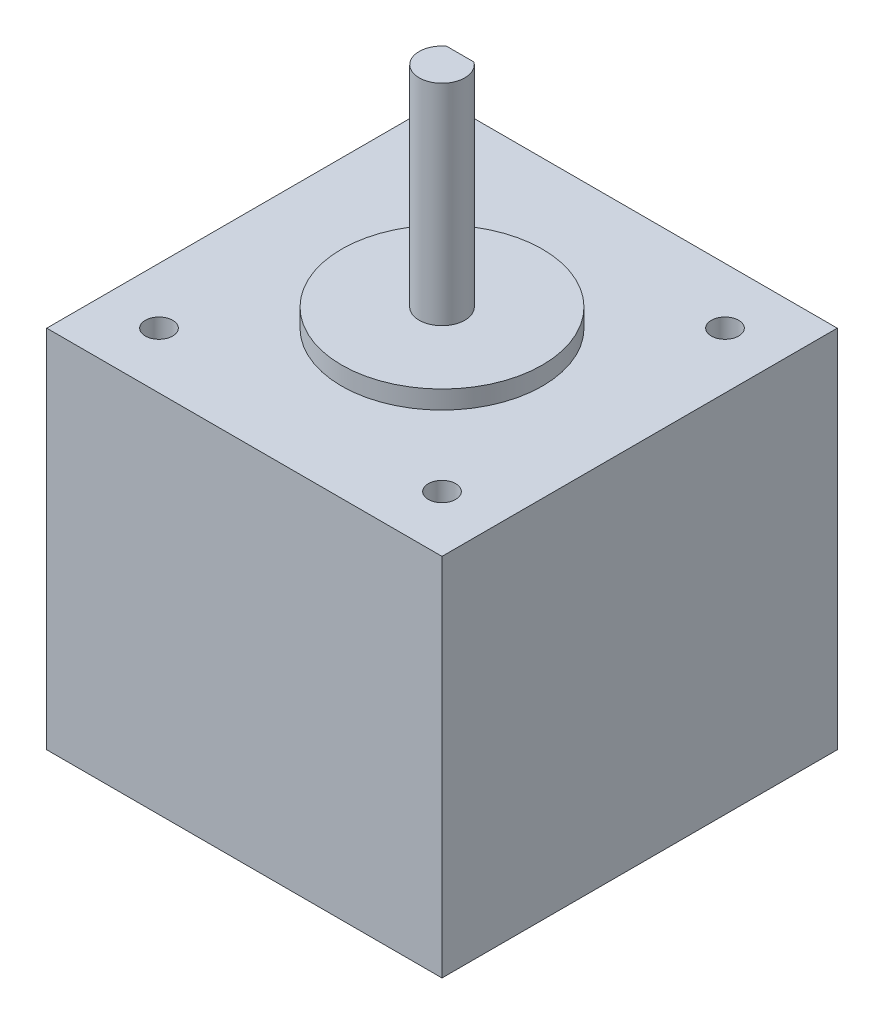
ISO-10303-21;
HEADER;
FILE_DESCRIPTION(('STEP AP214'),'2;1');
FILE_NAME('part.step','',(''),(''),'','','');
FILE_SCHEMA(('AUTOMOTIVE_DESIGN { 1 0 10303 214 1 1 1 1 }'));
ENDSEC;
DATA;
#1=APPLICATION_CONTEXT('core data for automotive mechanical design processes');
#2=APPLICATION_PROTOCOL_DEFINITION('international standard','automotive_design',2000,#1);
#3=PRODUCT_CONTEXT('',#1,'mechanical');
#4=PRODUCT('Part','Part','',(#3));
#5=PRODUCT_RELATED_PRODUCT_CATEGORY('part','',(#4));
#6=PRODUCT_DEFINITION_FORMATION('','',#4);
#7=PRODUCT_DEFINITION_CONTEXT('part definition',#1,'design');
#8=PRODUCT_DEFINITION('design','',#6,#7);
#9=PRODUCT_DEFINITION_SHAPE('','',#8);
#10=(LENGTH_UNIT() NAMED_UNIT(*) SI_UNIT(.MILLI.,.METRE.));
#11=(NAMED_UNIT(*) PLANE_ANGLE_UNIT() SI_UNIT($,.RADIAN.));
#12=(NAMED_UNIT(*) SI_UNIT($,.STERADIAN.) SOLID_ANGLE_UNIT());
#13=UNCERTAINTY_MEASURE_WITH_UNIT(LENGTH_MEASURE(1.E-05),#10,'distance_accuracy_value','');
#14=(GEOMETRIC_REPRESENTATION_CONTEXT(3) GLOBAL_UNCERTAINTY_ASSIGNED_CONTEXT((#13)) GLOBAL_UNIT_ASSIGNED_CONTEXT((#10,
#11,#12)) REPRESENTATION_CONTEXT('',''));
#15=CARTESIAN_POINT('',(0.,0.,0.));
#16=DIRECTION('',(0.,0.,1.));
#17=DIRECTION('',(1.,0.,0.));
#18=AXIS2_PLACEMENT_3D('',#15,#16,#17);
#19=CARTESIAN_POINT('',(21.65,40.,-21.65));
#20=DIRECTION('',(-1.,0.,0.));
#21=DIRECTION('',(0.,0.,1.));
#22=AXIS2_PLACEMENT_3D('',#19,#20,#21);
#23=PLANE('',#22);
#24=DIRECTION('',(0.,0.,-1.));
#25=VECTOR('',#24,1.);
#26=CARTESIAN_POINT('',(21.65,0.,-21.65));
#27=LINE('',#26,#25);
#28=CARTESIAN_POINT('',(21.65,0.,21.65));
#29=VERTEX_POINT('',#28);
#30=CARTESIAN_POINT('',(21.65,0.,-21.65));
#31=VERTEX_POINT('',#30);
#32=EDGE_CURVE('E131',#29,#31,#27,.T.);
#33=ORIENTED_EDGE('',*,*,#32,.T.);
#34=DIRECTION('',(0.,-1.,0.));
#35=VECTOR('',#34,1.);
#36=CARTESIAN_POINT('',(21.65,40.,-21.65));
#37=LINE('',#36,#35);
#38=CARTESIAN_POINT('',(21.65,40.,-21.65));
#39=VERTEX_POINT('',#38);
#40=EDGE_CURVE('E136',#39,#31,#37,.T.);
#41=ORIENTED_EDGE('',*,*,#40,.F.);
#42=DIRECTION('',(0.,0.,-1.));
#43=VECTOR('',#42,1.);
#44=CARTESIAN_POINT('',(21.65,40.,-21.65));
#45=LINE('',#44,#43);
#46=CARTESIAN_POINT('',(21.65,40.,21.65));
#47=VERTEX_POINT('',#46);
#48=EDGE_CURVE('E137',#47,#39,#45,.T.);
#49=ORIENTED_EDGE('',*,*,#48,.F.);
#50=DIRECTION('',(0.,-1.,0.));
#51=VECTOR('',#50,1.);
#52=CARTESIAN_POINT('',(21.65,40.,21.65));
#53=LINE('',#52,#51);
#54=EDGE_CURVE('E147',#47,#29,#53,.T.);
#55=ORIENTED_EDGE('',*,*,#54,.T.);
#56=EDGE_LOOP('',(#33,#41,#49,#55));
#57=FACE_BOUND('',#56,.T.);
#58=ADVANCED_FACE('F43',(#57),#23,.F.);
#59=CARTESIAN_POINT('',(-21.65,40.,-21.65));
#60=DIRECTION('',(0.,0.,1.));
#61=DIRECTION('',(1.,0.,0.));
#62=AXIS2_PLACEMENT_3D('',#59,#60,#61);
#63=PLANE('',#62);
#64=DIRECTION('',(-1.,0.,0.));
#65=VECTOR('',#64,1.);
#66=CARTESIAN_POINT('',(-21.65,0.,-21.65));
#67=LINE('',#66,#65);
#68=CARTESIAN_POINT('',(-21.65,0.,-21.65));
#69=VERTEX_POINT('',#68);
#70=EDGE_CURVE('E151',#31,#69,#67,.T.);
#71=ORIENTED_EDGE('',*,*,#70,.T.);
#72=DIRECTION('',(0.,-1.,0.));
#73=VECTOR('',#72,1.);
#74=CARTESIAN_POINT('',(-21.65,40.,-21.65));
#75=LINE('',#74,#73);
#76=CARTESIAN_POINT('',(-21.65,40.,-21.65));
#77=VERTEX_POINT('',#76);
#78=EDGE_CURVE('E164',#77,#69,#75,.T.);
#79=ORIENTED_EDGE('',*,*,#78,.F.);
#80=DIRECTION('',(-1.,0.,0.));
#81=VECTOR('',#80,1.);
#82=CARTESIAN_POINT('',(-21.65,40.,-21.65));
#83=LINE('',#82,#81);
#84=EDGE_CURVE('E96',#39,#77,#83,.T.);
#85=ORIENTED_EDGE('',*,*,#84,.F.);
#86=ORIENTED_EDGE('',*,*,#40,.T.);
#87=EDGE_LOOP('',(#71,#79,#85,#86));
#88=FACE_BOUND('',#87,.T.);
#89=ADVANCED_FACE('F187',(#88),#63,.F.);
#90=CARTESIAN_POINT('',(-21.65,40.,-21.65));
#91=DIRECTION('',(1.,0.,0.));
#92=DIRECTION('',(0.,0.,-1.));
#93=AXIS2_PLACEMENT_3D('',#90,#91,#92);
#94=PLANE('',#93);
#95=DIRECTION('',(0.,0.,1.));
#96=VECTOR('',#95,1.);
#97=CARTESIAN_POINT('',(-21.65,0.,-21.65));
#98=LINE('',#97,#96);
#99=CARTESIAN_POINT('',(-21.65,0.,21.65));
#100=VERTEX_POINT('',#99);
#101=EDGE_CURVE('E154',#69,#100,#98,.T.);
#102=ORIENTED_EDGE('',*,*,#101,.T.);
#103=DIRECTION('',(0.,-1.,0.));
#104=VECTOR('',#103,1.);
#105=CARTESIAN_POINT('',(-21.65,40.,21.65));
#106=LINE('',#105,#104);
#107=CARTESIAN_POINT('',(-21.65,40.,21.65));
#108=VERTEX_POINT('',#107);
#109=EDGE_CURVE('E161',#108,#100,#106,.T.);
#110=ORIENTED_EDGE('',*,*,#109,.F.);
#111=DIRECTION('',(0.,0.,1.));
#112=VECTOR('',#111,1.);
#113=CARTESIAN_POINT('',(-21.65,40.,-21.65));
#114=LINE('',#113,#112);
#115=EDGE_CURVE('E142',#77,#108,#114,.T.);
#116=ORIENTED_EDGE('',*,*,#115,.F.);
#117=ORIENTED_EDGE('',*,*,#78,.T.);
#118=EDGE_LOOP('',(#102,#110,#116,#117));
#119=FACE_BOUND('',#118,.T.);
#120=ADVANCED_FACE('F192',(#119),#94,.F.);
#121=CARTESIAN_POINT('',(-21.65,40.,21.65));
#122=DIRECTION('',(0.,0.,-1.));
#123=DIRECTION('',(-1.,0.,0.));
#124=AXIS2_PLACEMENT_3D('',#121,#122,#123);
#125=PLANE('',#124);
#126=DIRECTION('',(1.,0.,0.));
#127=VECTOR('',#126,1.);
#128=CARTESIAN_POINT('',(-21.65,0.,21.65));
#129=LINE('',#128,#127);
#130=EDGE_CURVE('E88',#100,#29,#129,.T.);
#131=ORIENTED_EDGE('',*,*,#130,.T.);
#132=ORIENTED_EDGE('',*,*,#54,.F.);
#133=DIRECTION('',(1.,0.,0.));
#134=VECTOR('',#133,1.);
#135=CARTESIAN_POINT('',(-21.65,40.,21.65));
#136=LINE('',#135,#134);
#137=EDGE_CURVE('E67',#108,#47,#136,.T.);
#138=ORIENTED_EDGE('',*,*,#137,.F.);
#139=ORIENTED_EDGE('',*,*,#109,.T.);
#140=EDGE_LOOP('',(#131,#132,#138,#139));
#141=FACE_BOUND('',#140,.T.);
#142=ADVANCED_FACE('F204',(#141),#125,.F.);
#143=CARTESIAN_POINT('',(0.,40.,0.));
#144=DIRECTION('',(0.,1.,0.));
#145=DIRECTION('',(0.,0.,1.));
#146=AXIS2_PLACEMENT_3D('',#143,#144,#145);
#147=PLANE('',#146);
#148=CARTESIAN_POINT('',(-15.5,40.,-15.5));
#149=DIRECTION('',(0.,1.,0.));
#150=DIRECTION('',(0.,0.,1.));
#151=AXIS2_PLACEMENT_3D('',#148,#149,#150);
#152=CIRCLE('',#151,1.5);
#153=CARTESIAN_POINT('',(-15.5,40.,-14.));
#154=VERTEX_POINT('',#153);
#155=EDGE_CURVE('E415',#154,#154,#152,.T.);
#156=ORIENTED_EDGE('',*,*,#155,.F.);
#157=EDGE_LOOP('',(#156));
#158=FACE_BOUND('',#157,.T.);
#159=CARTESIAN_POINT('',(-15.5,40.,15.5));
#160=DIRECTION('',(0.,1.,0.));
#161=DIRECTION('',(0.,0.,1.));
#162=AXIS2_PLACEMENT_3D('',#159,#160,#161);
#163=CIRCLE('',#162,1.5);
#164=CARTESIAN_POINT('',(-15.5,40.,17.));
#165=VERTEX_POINT('',#164);
#166=EDGE_CURVE('E440',#165,#165,#163,.T.);
#167=ORIENTED_EDGE('',*,*,#166,.F.);
#168=EDGE_LOOP('',(#167));
#169=FACE_BOUND('',#168,.T.);
#170=CARTESIAN_POINT('',(15.5,40.,15.5));
#171=DIRECTION('',(0.,1.,0.));
#172=DIRECTION('',(0.,0.,1.));
#173=AXIS2_PLACEMENT_3D('',#170,#171,#172);
#174=CIRCLE('',#173,1.5);
#175=CARTESIAN_POINT('',(15.5,40.,17.));
#176=VERTEX_POINT('',#175);
#177=EDGE_CURVE('E429',#176,#176,#174,.T.);
#178=ORIENTED_EDGE('',*,*,#177,.F.);
#179=EDGE_LOOP('',(#178));
#180=FACE_BOUND('',#179,.T.);
#181=CARTESIAN_POINT('',(15.5,40.,-15.5));
#182=DIRECTION('',(0.,1.,0.));
#183=DIRECTION('',(0.,0.,1.));
#184=AXIS2_PLACEMENT_3D('',#181,#182,#183);
#185=CIRCLE('',#184,1.5);
#186=CARTESIAN_POINT('',(15.5,40.,-14.));
#187=VERTEX_POINT('',#186);
#188=EDGE_CURVE('E426',#187,#187,#185,.T.);
#189=ORIENTED_EDGE('',*,*,#188,.F.);
#190=EDGE_LOOP('',(#189));
#191=FACE_BOUND('',#190,.T.);
#192=CARTESIAN_POINT('',(0.,40.,0.));
#193=DIRECTION('',(0.,1.,0.));
#194=DIRECTION('',(0.,0.,1.));
#195=AXIS2_PLACEMENT_3D('',#192,#193,#194);
#196=CIRCLE('',#195,11.);
#197=CARTESIAN_POINT('',(0.,40.,11.));
#198=VERTEX_POINT('',#197);
#199=EDGE_CURVE('E132',#198,#198,#196,.T.);
#200=ORIENTED_EDGE('',*,*,#199,.F.);
#201=EDGE_LOOP('',(#200));
#202=FACE_BOUND('',#201,.T.);
#203=ORIENTED_EDGE('',*,*,#48,.T.);
#204=ORIENTED_EDGE('',*,*,#84,.T.);
#205=ORIENTED_EDGE('',*,*,#115,.T.);
#206=ORIENTED_EDGE('',*,*,#137,.T.);
#207=EDGE_LOOP('',(#203,#204,#205,#206));
#208=FACE_BOUND('',#207,.T.);
#209=ADVANCED_FACE('F202',(#158,#169,#180,#191,#202,#208),#147,.T.);
#210=CARTESIAN_POINT('',(0.,0.,0.));
#211=DIRECTION('',(0.,1.,0.));
#212=DIRECTION('',(0.,0.,1.));
#213=AXIS2_PLACEMENT_3D('',#210,#211,#212);
#214=PLANE('',#213);
#215=ORIENTED_EDGE('',*,*,#32,.F.);
#216=ORIENTED_EDGE('',*,*,#130,.F.);
#217=ORIENTED_EDGE('',*,*,#101,.F.);
#218=ORIENTED_EDGE('',*,*,#70,.F.);
#219=EDGE_LOOP('',(#215,#216,#217,#218));
#220=FACE_BOUND('',#219,.T.);
#221=ADVANCED_FACE('F197',(#220),#214,.F.);
#222=CARTESIAN_POINT('',(0.,42.,0.));
#223=DIRECTION('',(0.,-1.,0.));
#224=DIRECTION('',(0.,0.,-1.));
#225=AXIS2_PLACEMENT_3D('',#222,#223,#224);
#226=CYLINDRICAL_SURFACE('',#225,11.);
#227=CARTESIAN_POINT('',(0.,42.,0.));
#228=DIRECTION('',(0.,1.,0.));
#229=DIRECTION('',(0.,0.,1.));
#230=AXIS2_PLACEMENT_3D('',#227,#228,#229);
#231=CIRCLE('',#230,11.);
#232=CARTESIAN_POINT('',(0.,42.,11.));
#233=VERTEX_POINT('',#232);
#234=EDGE_CURVE('E127',#233,#233,#231,.T.);
#235=ORIENTED_EDGE('',*,*,#234,.F.);
#236=EDGE_LOOP('',(#235));
#237=FACE_BOUND('',#236,.T.);
#238=ORIENTED_EDGE('',*,*,#199,.T.);
#239=EDGE_LOOP('',(#238));
#240=FACE_BOUND('',#239,.T.);
#241=ADVANCED_FACE('F211',(#237,#240),#226,.T.);
#242=CARTESIAN_POINT('',(0.,42.,0.));
#243=DIRECTION('',(0.,1.,0.));
#244=DIRECTION('',(0.,0.,1.));
#245=AXIS2_PLACEMENT_3D('',#242,#243,#244);
#246=PLANE('',#245);
#247=CARTESIAN_POINT('',(0.,42.,0.));
#248=DIRECTION('',(0.,1.,0.));
#249=DIRECTION('',(0.,0.,1.));
#250=AXIS2_PLACEMENT_3D('',#247,#248,#249);
#251=CIRCLE('',#250,2.5);
#252=CARTESIAN_POINT('',(0.,42.,2.5));
#253=VERTEX_POINT('',#252);
#254=EDGE_CURVE('E123',#253,#253,#251,.F.);
#255=ORIENTED_EDGE('',*,*,#254,.T.);
#256=EDGE_LOOP('',(#255));
#257=FACE_BOUND('',#256,.T.);
#258=ORIENTED_EDGE('',*,*,#234,.T.);
#259=EDGE_LOOP('',(#258));
#260=FACE_BOUND('',#259,.T.);
#261=ADVANCED_FACE('F182',(#257,#260),#246,.T.);
#262=CARTESIAN_POINT('',(0.,65.,0.));
#263=DIRECTION('',(0.,-1.,0.));
#264=DIRECTION('',(0.,0.,-1.));
#265=AXIS2_PLACEMENT_3D('',#262,#263,#264);
#266=CYLINDRICAL_SURFACE('',#265,2.5);
#267=ORIENTED_EDGE('',*,*,#254,.F.);
#268=EDGE_LOOP('',(#267));
#269=FACE_BOUND('',#268,.T.);
#270=DIRECTION('',(0.,-1.,0.));
#271=VECTOR('',#270,1.);
#272=CARTESIAN_POINT('',(-1.5,65.,-2.));
#273=LINE('',#272,#271);
#274=CARTESIAN_POINT('',(-1.5,65.,-2.));
#275=VERTEX_POINT('',#274);
#276=CARTESIAN_POINT('',(-1.5,50.,-2.));
#277=VERTEX_POINT('',#276);
#278=EDGE_CURVE('E58',#275,#277,#273,.T.);
#279=ORIENTED_EDGE('',*,*,#278,.T.);
#280=CARTESIAN_POINT('',(0.,50.,0.));
#281=DIRECTION('',(0.,-1.,0.));
#282=DIRECTION('',(0.,0.,-1.));
#283=AXIS2_PLACEMENT_3D('',#280,#281,#282);
#284=CIRCLE('',#283,2.5);
#285=CARTESIAN_POINT('',(1.5,50.,-2.));
#286=VERTEX_POINT('',#285);
#287=EDGE_CURVE('E11',#277,#286,#284,.T.);
#288=ORIENTED_EDGE('',*,*,#287,.T.);
#289=DIRECTION('',(0.,-1.,0.));
#290=VECTOR('',#289,1.);
#291=CARTESIAN_POINT('',(1.5,65.,-2.));
#292=LINE('',#291,#290);
#293=CARTESIAN_POINT('',(1.5,65.,-2.));
#294=VERTEX_POINT('',#293);
#295=EDGE_CURVE('E111',#286,#294,#292,.F.);
#296=ORIENTED_EDGE('',*,*,#295,.T.);
#297=CARTESIAN_POINT('',(0.,65.,0.));
#298=DIRECTION('',(0.,1.,0.));
#299=DIRECTION('',(0.,0.,1.));
#300=AXIS2_PLACEMENT_3D('',#297,#298,#299);
#301=CIRCLE('',#300,2.5);
#302=EDGE_CURVE('E118',#275,#294,#301,.T.);
#303=ORIENTED_EDGE('',*,*,#302,.F.);
#304=EDGE_LOOP('',(#279,#288,#296,#303));
#305=FACE_BOUND('',#304,.T.);
#306=ADVANCED_FACE('F116',(#269,#305),#266,.T.);
#307=CARTESIAN_POINT('',(0.,65.,0.));
#308=DIRECTION('',(0.,1.,0.));
#309=DIRECTION('',(0.,0.,1.));
#310=AXIS2_PLACEMENT_3D('',#307,#308,#309);
#311=PLANE('',#310);
#312=DIRECTION('',(1.,0.,0.));
#313=VECTOR('',#312,1.);
#314=CARTESIAN_POINT('',(0.,65.,-2.));
#315=LINE('',#314,#313);
#316=EDGE_CURVE('E51',#275,#294,#315,.T.);
#317=ORIENTED_EDGE('',*,*,#316,.F.);
#318=ORIENTED_EDGE('',*,*,#302,.T.);
#319=EDGE_LOOP('',(#317,#318));
#320=FACE_BOUND('',#319,.T.);
#321=ADVANCED_FACE('F174',(#320),#311,.T.);
#322=CARTESIAN_POINT('',(-21.65,50.,-2.));
#323=DIRECTION('',(0.,-1.,0.));
#324=DIRECTION('',(0.,0.,-1.));
#325=AXIS2_PLACEMENT_3D('',#322,#323,#324);
#326=PLANE('',#325);
#327=ORIENTED_EDGE('',*,*,#287,.F.);
#328=DIRECTION('',(1.,0.,0.));
#329=VECTOR('',#328,1.);
#330=CARTESIAN_POINT('',(-21.65,50.,-2.));
#331=LINE('',#330,#329);
#332=EDGE_CURVE('E107',#277,#286,#331,.T.);
#333=ORIENTED_EDGE('',*,*,#332,.T.);
#334=EDGE_LOOP('',(#327,#333));
#335=FACE_BOUND('',#334,.T.);
#336=ADVANCED_FACE('F106',(#335),#326,.F.);
#337=CARTESIAN_POINT('',(-21.65,50.,-2.));
#338=DIRECTION('',(0.,0.,1.));
#339=DIRECTION('',(1.,0.,0.));
#340=AXIS2_PLACEMENT_3D('',#337,#338,#339);
#341=PLANE('',#340);
#342=ORIENTED_EDGE('',*,*,#316,.T.);
#343=ORIENTED_EDGE('',*,*,#295,.F.);
#344=ORIENTED_EDGE('',*,*,#332,.F.);
#345=ORIENTED_EDGE('',*,*,#278,.F.);
#346=EDGE_LOOP('',(#342,#343,#344,#345));
#347=FACE_BOUND('',#346,.T.);
#348=ADVANCED_FACE('F110',(#347),#341,.F.);
#349=CARTESIAN_POINT('',(15.5,35.5,-15.5));
#350=DIRECTION('',(0.,1.,0.));
#351=DIRECTION('',(0.,0.,1.));
#352=AXIS2_PLACEMENT_3D('',#349,#350,#351);
#353=CYLINDRICAL_SURFACE('',#352,1.5);
#354=CARTESIAN_POINT('',(15.5,35.5,-15.5));
#355=DIRECTION('',(0.,1.,0.));
#356=DIRECTION('',(0.,0.,1.));
#357=AXIS2_PLACEMENT_3D('',#354,#355,#356);
#358=CIRCLE('',#357,1.5);
#359=CARTESIAN_POINT('',(15.5,35.5,-14.));
#360=VERTEX_POINT('',#359);
#361=EDGE_CURVE('E113',#360,#360,#358,.T.);
#362=ORIENTED_EDGE('',*,*,#361,.F.);
#363=EDGE_LOOP('',(#362));
#364=FACE_BOUND('',#363,.T.);
#365=ORIENTED_EDGE('',*,*,#188,.T.);
#366=EDGE_LOOP('',(#365));
#367=FACE_BOUND('',#366,.T.);
#368=ADVANCED_FACE('F282',(#364,#367),#353,.F.);
#369=CARTESIAN_POINT('',(15.5,35.5,-15.5));
#370=DIRECTION('',(0.,1.,0.));
#371=DIRECTION('',(0.,0.,1.));
#372=AXIS2_PLACEMENT_3D('',#369,#370,#371);
#373=PLANE('',#372);
#374=ORIENTED_EDGE('',*,*,#361,.T.);
#375=EDGE_LOOP('',(#374));
#376=FACE_BOUND('',#375,.T.);
#377=ADVANCED_FACE('F296',(#376),#373,.T.);
#378=CARTESIAN_POINT('',(15.5,35.5,15.5));
#379=DIRECTION('',(0.,1.,0.));
#380=DIRECTION('',(0.,0.,1.));
#381=AXIS2_PLACEMENT_3D('',#378,#379,#380);
#382=CYLINDRICAL_SURFACE('',#381,1.5);
#383=CARTESIAN_POINT('',(15.5,35.5,15.5));
#384=DIRECTION('',(0.,1.,0.));
#385=DIRECTION('',(0.,0.,1.));
#386=AXIS2_PLACEMENT_3D('',#383,#384,#385);
#387=CIRCLE('',#386,1.5);
#388=CARTESIAN_POINT('',(15.5,35.5,17.));
#389=VERTEX_POINT('',#388);
#390=EDGE_CURVE('E434',#389,#389,#387,.T.);
#391=ORIENTED_EDGE('',*,*,#390,.F.);
#392=EDGE_LOOP('',(#391));
#393=FACE_BOUND('',#392,.T.);
#394=ORIENTED_EDGE('',*,*,#177,.T.);
#395=EDGE_LOOP('',(#394));
#396=FACE_BOUND('',#395,.T.);
#397=ADVANCED_FACE('F307',(#393,#396),#382,.F.);
#398=CARTESIAN_POINT('',(15.5,35.5,15.5));
#399=DIRECTION('',(0.,1.,0.));
#400=DIRECTION('',(0.,0.,1.));
#401=AXIS2_PLACEMENT_3D('',#398,#399,#400);
#402=PLANE('',#401);
#403=ORIENTED_EDGE('',*,*,#390,.T.);
#404=EDGE_LOOP('',(#403));
#405=FACE_BOUND('',#404,.T.);
#406=ADVANCED_FACE('F318',(#405),#402,.T.);
#407=CARTESIAN_POINT('',(-15.5,35.5,15.5));
#408=DIRECTION('',(0.,1.,0.));
#409=DIRECTION('',(0.,0.,1.));
#410=AXIS2_PLACEMENT_3D('',#407,#408,#409);
#411=CYLINDRICAL_SURFACE('',#410,1.5);
#412=CARTESIAN_POINT('',(-15.5,35.5,15.5));
#413=DIRECTION('',(0.,1.,0.));
#414=DIRECTION('',(0.,0.,1.));
#415=AXIS2_PLACEMENT_3D('',#412,#413,#414);
#416=CIRCLE('',#415,1.5);
#417=CARTESIAN_POINT('',(-15.5,35.5,17.));
#418=VERTEX_POINT('',#417);
#419=EDGE_CURVE('E419',#418,#418,#416,.T.);
#420=ORIENTED_EDGE('',*,*,#419,.F.);
#421=EDGE_LOOP('',(#420));
#422=FACE_BOUND('',#421,.T.);
#423=ORIENTED_EDGE('',*,*,#166,.T.);
#424=EDGE_LOOP('',(#423));
#425=FACE_BOUND('',#424,.T.);
#426=ADVANCED_FACE('F329',(#422,#425),#411,.F.);
#427=CARTESIAN_POINT('',(-15.5,35.5,15.5));
#428=DIRECTION('',(0.,1.,0.));
#429=DIRECTION('',(0.,0.,1.));
#430=AXIS2_PLACEMENT_3D('',#427,#428,#429);
#431=PLANE('',#430);
#432=ORIENTED_EDGE('',*,*,#419,.T.);
#433=EDGE_LOOP('',(#432));
#434=FACE_BOUND('',#433,.T.);
#435=ADVANCED_FACE('F340',(#434),#431,.T.);
#436=CARTESIAN_POINT('',(-15.5,35.5,-15.5));
#437=DIRECTION('',(0.,1.,0.));
#438=DIRECTION('',(0.,0.,1.));
#439=AXIS2_PLACEMENT_3D('',#436,#437,#438);
#440=CYLINDRICAL_SURFACE('',#439,1.5);
#441=CARTESIAN_POINT('',(-15.5,35.5,-15.5));
#442=DIRECTION('',(0.,1.,0.));
#443=DIRECTION('',(0.,0.,1.));
#444=AXIS2_PLACEMENT_3D('',#441,#442,#443);
#445=CIRCLE('',#444,1.5);
#446=CARTESIAN_POINT('',(-15.5,35.5,-14.));
#447=VERTEX_POINT('',#446);
#448=EDGE_CURVE('E413',#447,#447,#445,.T.);
#449=ORIENTED_EDGE('',*,*,#448,.F.);
#450=EDGE_LOOP('',(#449));
#451=FACE_BOUND('',#450,.T.);
#452=ORIENTED_EDGE('',*,*,#155,.T.);
#453=EDGE_LOOP('',(#452));
#454=FACE_BOUND('',#453,.T.);
#455=ADVANCED_FACE('F351',(#451,#454),#440,.F.);
#456=CARTESIAN_POINT('',(-15.5,35.5,-15.5));
#457=DIRECTION('',(0.,1.,0.));
#458=DIRECTION('',(0.,0.,1.));
#459=AXIS2_PLACEMENT_3D('',#456,#457,#458);
#460=PLANE('',#459);
#461=ORIENTED_EDGE('',*,*,#448,.T.);
#462=EDGE_LOOP('',(#461));
#463=FACE_BOUND('',#462,.T.);
#464=ADVANCED_FACE('F362',(#463),#460,.T.);
#465=CLOSED_SHELL('',(#58,#89,#120,#142,#209,#221,#241,#261,#306,#321,#336,#348,#368,#377,#397,
#406,#426,#435,#455,#464));
#466=MANIFOLD_SOLID_BREP('B2',#465);
#467=ADVANCED_BREP_SHAPE_REPRESENTATION('',(#18,#466),#14);
#468=SHAPE_DEFINITION_REPRESENTATION(#9,#467);
ENDSEC;
END-ISO-10303-21;
